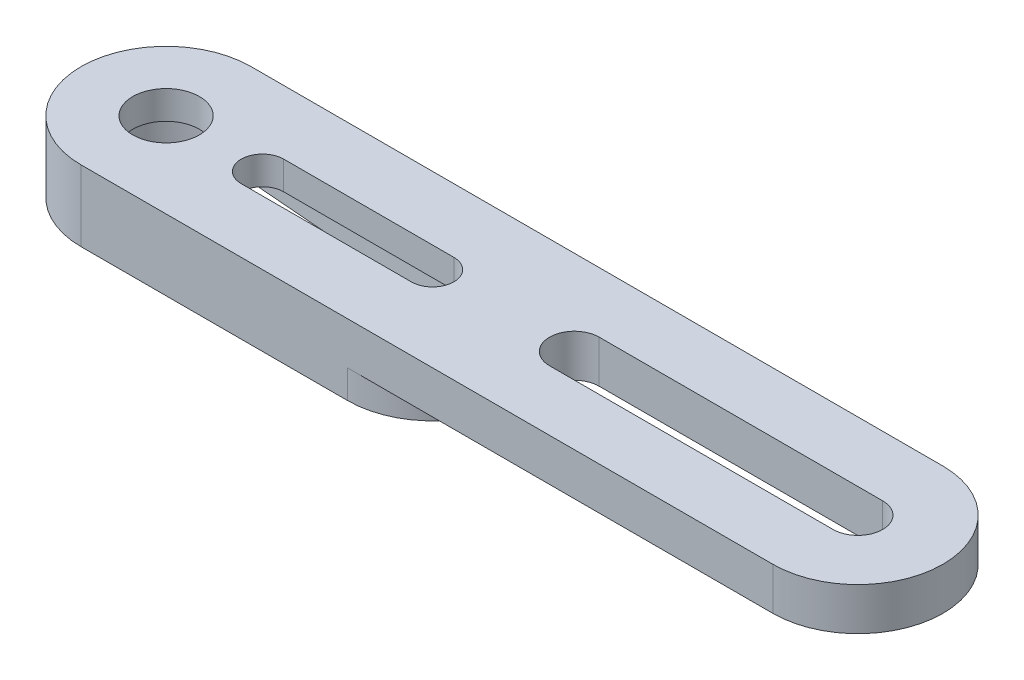
ISO-10303-21;
HEADER;
FILE_DESCRIPTION(('STEP AP214'),'2;1');
FILE_NAME('part.step','',(''),(''),'','','');
FILE_SCHEMA(('AUTOMOTIVE_DESIGN { 1 0 10303 214 1 1 1 1 }'));
ENDSEC;
DATA;
#1=APPLICATION_CONTEXT('core data for automotive mechanical design processes');
#2=APPLICATION_PROTOCOL_DEFINITION('international standard','automotive_design',2000,#1);
#3=PRODUCT_CONTEXT('',#1,'mechanical');
#4=PRODUCT('Part','Part','',(#3));
#5=PRODUCT_RELATED_PRODUCT_CATEGORY('part','',(#4));
#6=PRODUCT_DEFINITION_FORMATION('','',#4);
#7=PRODUCT_DEFINITION_CONTEXT('part definition',#1,'design');
#8=PRODUCT_DEFINITION('design','',#6,#7);
#9=PRODUCT_DEFINITION_SHAPE('','',#8);
#10=(LENGTH_UNIT() NAMED_UNIT(*) SI_UNIT(.MILLI.,.METRE.));
#11=(NAMED_UNIT(*) PLANE_ANGLE_UNIT() SI_UNIT($,.RADIAN.));
#12=(NAMED_UNIT(*) SI_UNIT($,.STERADIAN.) SOLID_ANGLE_UNIT());
#13=UNCERTAINTY_MEASURE_WITH_UNIT(LENGTH_MEASURE(1.E-05),#10,'distance_accuracy_value','');
#14=(GEOMETRIC_REPRESENTATION_CONTEXT(3) GLOBAL_UNCERTAINTY_ASSIGNED_CONTEXT((#13)) GLOBAL_UNIT_ASSIGNED_CONTEXT((#10,
#11,#12)) REPRESENTATION_CONTEXT('',''));
#15=CARTESIAN_POINT('',(0.,0.,0.));
#16=DIRECTION('',(0.,0.,1.));
#17=DIRECTION('',(1.,0.,0.));
#18=AXIS2_PLACEMENT_3D('',#15,#16,#17);
#19=CARTESIAN_POINT('',(0.,2.,0.));
#20=DIRECTION('',(0.,1.,0.));
#21=DIRECTION('',(0.,0.,1.));
#22=AXIS2_PLACEMENT_3D('',#19,#20,#21);
#23=PLANE('',#22);
#24=DIRECTION('',(1.,0.,0.));
#25=VECTOR('',#24,1.);
#26=CARTESIAN_POINT('',(0.,2.,6.));
#27=LINE('',#26,#25);
#28=CARTESIAN_POINT('',(0.,2.,6.));
#29=VERTEX_POINT('',#28);
#30=CARTESIAN_POINT('',(48.8,2.,6.));
#31=VERTEX_POINT('',#30);
#32=EDGE_CURVE('E245',#29,#31,#27,.T.);
#33=ORIENTED_EDGE('',*,*,#32,.T.);
#34=CARTESIAN_POINT('',(48.8,2.,0.));
#35=DIRECTION('',(0.,1.,0.));
#36=DIRECTION('',(0.,0.,1.));
#37=AXIS2_PLACEMENT_3D('',#34,#35,#36);
#38=CIRCLE('',#37,6.);
#39=CARTESIAN_POINT('',(48.8,2.,-6.));
#40=VERTEX_POINT('',#39);
#41=EDGE_CURVE('E199',#31,#40,#38,.T.);
#42=ORIENTED_EDGE('',*,*,#41,.T.);
#43=DIRECTION('',(-1.,0.,0.));
#44=VECTOR('',#43,1.);
#45=CARTESIAN_POINT('',(0.,2.,-6.));
#46=LINE('',#45,#44);
#47=CARTESIAN_POINT('',(0.,2.,-6.));
#48=VERTEX_POINT('',#47);
#49=EDGE_CURVE('E247',#40,#48,#46,.T.);
#50=ORIENTED_EDGE('',*,*,#49,.T.);
#51=CARTESIAN_POINT('',(0.,2.,0.));
#52=DIRECTION('',(0.,1.,0.));
#53=DIRECTION('',(0.,0.,1.));
#54=AXIS2_PLACEMENT_3D('',#51,#52,#53);
#55=CIRCLE('',#54,6.);
#56=EDGE_CURVE('E250',#48,#29,#55,.T.);
#57=ORIENTED_EDGE('',*,*,#56,.T.);
#58=EDGE_LOOP('',(#33,#42,#50,#57));
#59=FACE_BOUND('',#58,.T.);
#60=CARTESIAN_POINT('',(0.,2.,0.));
#61=DIRECTION('',(0.,1.,0.));
#62=DIRECTION('',(0.,0.,1.));
#63=AXIS2_PLACEMENT_3D('',#60,#61,#62);
#64=CIRCLE('',#63,2.35);
#65=CARTESIAN_POINT('',(0.,2.,2.35));
#66=VERTEX_POINT('',#65);
#67=EDGE_CURVE('E253',#66,#66,#64,.T.);
#68=ORIENTED_EDGE('',*,*,#67,.F.);
#69=EDGE_LOOP('',(#68));
#70=FACE_BOUND('',#69,.T.);
#71=DIRECTION('',(-1.,0.,0.));
#72=VECTOR('',#71,1.);
#73=CARTESIAN_POINT('',(0.,2.,-1.74999999999999));
#74=LINE('',#73,#72);
#75=CARTESIAN_POINT('',(48.8,2.,-1.75));
#76=VERTEX_POINT('',#75);
#77=CARTESIAN_POINT('',(28.8,2.,-1.75));
#78=VERTEX_POINT('',#77);
#79=EDGE_CURVE('E192',#76,#78,#74,.T.);
#80=ORIENTED_EDGE('',*,*,#79,.F.);
#81=CARTESIAN_POINT('',(48.8,2.,0.));
#82=DIRECTION('',(0.,1.,0.));
#83=DIRECTION('',(0.,0.,1.));
#84=AXIS2_PLACEMENT_3D('',#81,#82,#83);
#85=CIRCLE('',#84,1.75);
#86=CARTESIAN_POINT('',(48.8,2.,1.75));
#87=VERTEX_POINT('',#86);
#88=EDGE_CURVE('E219',#87,#76,#85,.T.);
#89=ORIENTED_EDGE('',*,*,#88,.F.);
#90=DIRECTION('',(-1.,0.,0.));
#91=VECTOR('',#90,1.);
#92=CARTESIAN_POINT('',(0.,2.,1.75000000000001));
#93=LINE('',#92,#91);
#94=CARTESIAN_POINT('',(28.8,2.,1.75));
#95=VERTEX_POINT('',#94);
#96=EDGE_CURVE('E221',#87,#95,#93,.T.);
#97=ORIENTED_EDGE('',*,*,#96,.T.);
#98=CARTESIAN_POINT('',(28.8,2.,0.));
#99=DIRECTION('',(0.,1.,0.));
#100=DIRECTION('',(0.,0.,1.));
#101=AXIS2_PLACEMENT_3D('',#98,#99,#100);
#102=CIRCLE('',#101,1.75);
#103=EDGE_CURVE('E224',#78,#95,#102,.T.);
#104=ORIENTED_EDGE('',*,*,#103,.F.);
#105=EDGE_LOOP('',(#80,#89,#97,#104));
#106=FACE_BOUND('',#105,.T.);
#107=CARTESIAN_POINT('',(18.8,2.,0.));
#108=DIRECTION('',(0.,1.,0.));
#109=DIRECTION('',(0.,0.,1.));
#110=AXIS2_PLACEMENT_3D('',#107,#108,#109);
#111=CIRCLE('',#110,1.5);
#112=CARTESIAN_POINT('',(18.8,2.,1.5));
#113=VERTEX_POINT('',#112);
#114=CARTESIAN_POINT('',(18.8,2.,-1.5));
#115=VERTEX_POINT('',#114);
#116=EDGE_CURVE('E180',#113,#115,#111,.T.);
#117=ORIENTED_EDGE('',*,*,#116,.F.);
#118=DIRECTION('',(-1.,0.,0.));
#119=VECTOR('',#118,1.);
#120=CARTESIAN_POINT('',(0.,2.,1.5));
#121=LINE('',#120,#119);
#122=CARTESIAN_POINT('',(6.8,2.,1.5));
#123=VERTEX_POINT('',#122);
#124=EDGE_CURVE('E59',#113,#123,#121,.T.);
#125=ORIENTED_EDGE('',*,*,#124,.T.);
#126=CARTESIAN_POINT('',(6.8,2.,0.));
#127=DIRECTION('',(0.,1.,0.));
#128=DIRECTION('',(0.,0.,1.));
#129=AXIS2_PLACEMENT_3D('',#126,#127,#128);
#130=CIRCLE('',#129,1.5);
#131=CARTESIAN_POINT('',(6.8,2.,-1.5));
#132=VERTEX_POINT('',#131);
#133=EDGE_CURVE('E185',#132,#123,#130,.T.);
#134=ORIENTED_EDGE('',*,*,#133,.F.);
#135=DIRECTION('',(-1.,0.,0.));
#136=VECTOR('',#135,1.);
#137=CARTESIAN_POINT('',(0.,2.,-1.5));
#138=LINE('',#137,#136);
#139=EDGE_CURVE('E171',#115,#132,#138,.T.);
#140=ORIENTED_EDGE('',*,*,#139,.F.);
#141=EDGE_LOOP('',(#117,#125,#134,#140));
#142=FACE_BOUND('',#141,.T.);
#143=ADVANCED_FACE('F44',(#59,#70,#106,#142),#23,.T.);
#144=CARTESIAN_POINT('',(0.,0.,0.));
#145=DIRECTION('',(0.,1.,0.));
#146=DIRECTION('',(0.,0.,1.));
#147=AXIS2_PLACEMENT_3D('',#144,#145,#146);
#148=PLANE('',#147);
#149=CARTESIAN_POINT('',(0.,0.,0.));
#150=DIRECTION('',(0.,1.,0.));
#151=DIRECTION('',(0.,0.,1.));
#152=AXIS2_PLACEMENT_3D('',#149,#150,#151);
#153=CIRCLE('',#152,2.35);
#154=CARTESIAN_POINT('',(0.,0.,2.35));
#155=VERTEX_POINT('',#154);
#156=EDGE_CURVE('E232',#155,#155,#153,.T.);
#157=ORIENTED_EDGE('',*,*,#156,.T.);
#158=EDGE_LOOP('',(#157));
#159=FACE_BOUND('',#158,.T.);
#160=CARTESIAN_POINT('',(18.8,0.,0.));
#161=DIRECTION('',(0.,1.,0.));
#162=DIRECTION('',(0.,0.,1.));
#163=AXIS2_PLACEMENT_3D('',#160,#161,#162);
#164=CIRCLE('',#163,2.6);
#165=CARTESIAN_POINT('',(19.0074468085106,0.,2.59171098343136));
#166=VERTEX_POINT('',#165);
#167=CARTESIAN_POINT('',(19.0074468085106,0.,-2.59171098343136));
#168=VERTEX_POINT('',#167);
#169=EDGE_CURVE('E256',#166,#168,#164,.T.);
#170=ORIENTED_EDGE('',*,*,#169,.F.);
#171=DIRECTION('',(-0.99681191670437,0.,0.0797872340425532));
#172=VECTOR('',#171,1.);
#173=CARTESIAN_POINT('',(0.327127659574468,0.,4.08692885848792));
#174=LINE('',#173,#172);
#175=CARTESIAN_POINT('',(0.327127659574468,0.,4.08692885848792));
#176=VERTEX_POINT('',#175);
#177=EDGE_CURVE('E284',#166,#176,#174,.T.);
#178=ORIENTED_EDGE('',*,*,#177,.T.);
#179=CARTESIAN_POINT('',(0.,0.,0.));
#180=DIRECTION('',(0.,1.,0.));
#181=DIRECTION('',(0.,0.,1.));
#182=AXIS2_PLACEMENT_3D('',#179,#180,#181);
#183=CIRCLE('',#182,4.1);
#184=CARTESIAN_POINT('',(0.327127659574468,0.,-4.08692885848792));
#185=VERTEX_POINT('',#184);
#186=EDGE_CURVE('E287',#185,#176,#183,.T.);
#187=ORIENTED_EDGE('',*,*,#186,.F.);
#188=DIRECTION('',(0.99681191670437,0.,0.0797872340425532));
#189=VECTOR('',#188,1.);
#190=CARTESIAN_POINT('',(0.327127659574468,0.,-4.08692885848792));
#191=LINE('',#190,#189);
#192=EDGE_CURVE('E263',#185,#168,#191,.T.);
#193=ORIENTED_EDGE('',*,*,#192,.T.);
#194=EDGE_LOOP('',(#170,#178,#187,#193));
#195=FACE_BOUND('',#194,.T.);
#196=DIRECTION('',(-1.,0.,0.));
#197=VECTOR('',#196,1.);
#198=CARTESIAN_POINT('',(0.,0.,1.5));
#199=LINE('',#198,#197);
#200=CARTESIAN_POINT('',(18.8,0.,1.5));
#201=VERTEX_POINT('',#200);
#202=CARTESIAN_POINT('',(6.8,0.,1.5));
#203=VERTEX_POINT('',#202);
#204=EDGE_CURVE('E12',#201,#203,#199,.T.);
#205=ORIENTED_EDGE('',*,*,#204,.F.);
#206=CARTESIAN_POINT('',(18.8,0.,0.));
#207=DIRECTION('',(0.,1.,0.));
#208=DIRECTION('',(0.,0.,1.));
#209=AXIS2_PLACEMENT_3D('',#206,#207,#208);
#210=CIRCLE('',#209,1.5);
#211=CARTESIAN_POINT('',(18.8,0.,-1.5));
#212=VERTEX_POINT('',#211);
#213=EDGE_CURVE('E295',#201,#212,#210,.T.);
#214=ORIENTED_EDGE('',*,*,#213,.T.);
#215=DIRECTION('',(-1.,0.,0.));
#216=VECTOR('',#215,1.);
#217=CARTESIAN_POINT('',(0.,0.,-1.5));
#218=LINE('',#217,#216);
#219=CARTESIAN_POINT('',(6.8,0.,-1.5));
#220=VERTEX_POINT('',#219);
#221=EDGE_CURVE('E174',#212,#220,#218,.T.);
#222=ORIENTED_EDGE('',*,*,#221,.T.);
#223=CARTESIAN_POINT('',(6.8,0.,0.));
#224=DIRECTION('',(0.,1.,0.));
#225=DIRECTION('',(0.,0.,1.));
#226=AXIS2_PLACEMENT_3D('',#223,#224,#225);
#227=CIRCLE('',#226,1.5);
#228=EDGE_CURVE('E52',#220,#203,#227,.T.);
#229=ORIENTED_EDGE('',*,*,#228,.T.);
#230=EDGE_LOOP('',(#205,#214,#222,#229));
#231=FACE_BOUND('',#230,.T.);
#232=ADVANCED_FACE('F315',(#159,#195,#231),#148,.F.);
#233=CARTESIAN_POINT('',(18.8,-3.,0.));
#234=DIRECTION('',(0.,1.,0.));
#235=DIRECTION('',(0.,0.,1.));
#236=AXIS2_PLACEMENT_3D('',#233,#234,#235);
#237=CYLINDRICAL_SURFACE('',#236,6.);
#238=DIRECTION('',(0.,1.,0.));
#239=VECTOR('',#238,1.);
#240=CARTESIAN_POINT('',(18.8,-3.,-6.));
#241=LINE('',#240,#239);
#242=CARTESIAN_POINT('',(18.8,-3.,-6.));
#243=VERTEX_POINT('',#242);
#244=CARTESIAN_POINT('',(18.8,-1.,-6.));
#245=VERTEX_POINT('',#244);
#246=EDGE_CURVE('E306',#243,#245,#241,.T.);
#247=ORIENTED_EDGE('',*,*,#246,.T.);
#248=CARTESIAN_POINT('',(18.8,-1.,0.));
#249=DIRECTION('',(0.,1.,0.));
#250=DIRECTION('',(0.,0.,1.));
#251=AXIS2_PLACEMENT_3D('',#248,#249,#250);
#252=CIRCLE('',#251,6.);
#253=CARTESIAN_POINT('',(18.8,-1.,6.));
#254=VERTEX_POINT('',#253);
#255=EDGE_CURVE('E212',#254,#245,#252,.T.);
#256=ORIENTED_EDGE('',*,*,#255,.F.);
#257=DIRECTION('',(0.,1.,0.));
#258=VECTOR('',#257,1.);
#259=CARTESIAN_POINT('',(18.8,-3.,6.));
#260=LINE('',#259,#258);
#261=CARTESIAN_POINT('',(18.8,-3.,6.));
#262=VERTEX_POINT('',#261);
#263=EDGE_CURVE('E282',#262,#254,#260,.T.);
#264=ORIENTED_EDGE('',*,*,#263,.F.);
#265=CARTESIAN_POINT('',(18.8,-3.,0.));
#266=DIRECTION('',(0.,1.,0.));
#267=DIRECTION('',(0.,0.,1.));
#268=AXIS2_PLACEMENT_3D('',#265,#266,#267);
#269=CIRCLE('',#268,6.);
#270=EDGE_CURVE('E262',#262,#243,#269,.T.);
#271=ORIENTED_EDGE('',*,*,#270,.T.);
#272=EDGE_LOOP('',(#247,#256,#264,#271));
#273=FACE_BOUND('',#272,.T.);
#274=ADVANCED_FACE('F338',(#273),#237,.T.);
#275=CARTESIAN_POINT('',(18.8,-3.,0.));
#276=DIRECTION('',(0.,1.,0.));
#277=DIRECTION('',(0.,0.,1.));
#278=AXIS2_PLACEMENT_3D('',#275,#276,#277);
#279=CYLINDRICAL_SURFACE('',#278,2.6);
#280=ORIENTED_EDGE('',*,*,#169,.T.);
#281=DIRECTION('',(0.,1.,0.));
#282=VECTOR('',#281,1.);
#283=CARTESIAN_POINT('',(19.0074468085106,-3.,-2.59171098343136));
#284=LINE('',#283,#282);
#285=CARTESIAN_POINT('',(19.0074468085106,-3.,-2.59171098343136));
#286=VERTEX_POINT('',#285);
#287=EDGE_CURVE('E292',#286,#168,#284,.T.);
#288=ORIENTED_EDGE('',*,*,#287,.F.);
#289=CARTESIAN_POINT('',(18.8,-3.,0.));
#290=DIRECTION('',(0.,1.,0.));
#291=DIRECTION('',(0.,0.,1.));
#292=AXIS2_PLACEMENT_3D('',#289,#290,#291);
#293=CIRCLE('',#292,2.6);
#294=CARTESIAN_POINT('',(19.0074468085106,-3.,2.59171098343136));
#295=VERTEX_POINT('',#294);
#296=EDGE_CURVE('E272',#295,#286,#293,.T.);
#297=ORIENTED_EDGE('',*,*,#296,.F.);
#298=DIRECTION('',(0.,1.,0.));
#299=VECTOR('',#298,1.);
#300=CARTESIAN_POINT('',(19.0074468085106,-3.,2.59171098343136));
#301=LINE('',#300,#299);
#302=EDGE_CURVE('E300',#295,#166,#301,.T.);
#303=ORIENTED_EDGE('',*,*,#302,.T.);
#304=EDGE_LOOP('',(#280,#288,#297,#303));
#305=FACE_BOUND('',#304,.T.);
#306=ADVANCED_FACE('F360',(#305),#279,.F.);
#307=CARTESIAN_POINT('',(0.327127659574468,-3.,-4.08692885848792));
#308=DIRECTION('',(-0.0797872340425532,0.,0.996811916704369));
#309=DIRECTION('',(0.99681191670437,0.,0.0797872340425532));
#310=AXIS2_PLACEMENT_3D('',#307,#308,#309);
#311=PLANE('',#310);
#312=ORIENTED_EDGE('',*,*,#192,.F.);
#313=DIRECTION('',(0.,1.,0.));
#314=VECTOR('',#313,1.);
#315=CARTESIAN_POINT('',(0.327127659574468,-3.,-4.08692885848792));
#316=LINE('',#315,#314);
#317=CARTESIAN_POINT('',(0.327127659574468,-3.,-4.08692885848792));
#318=VERTEX_POINT('',#317);
#319=EDGE_CURVE('E296',#318,#185,#316,.T.);
#320=ORIENTED_EDGE('',*,*,#319,.F.);
#321=DIRECTION('',(0.99681191670437,0.,0.0797872340425532));
#322=VECTOR('',#321,1.);
#323=CARTESIAN_POINT('',(0.327127659574468,-3.,-4.08692885848792));
#324=LINE('',#323,#322);
#325=EDGE_CURVE('E279',#318,#286,#324,.T.);
#326=ORIENTED_EDGE('',*,*,#325,.T.);
#327=ORIENTED_EDGE('',*,*,#287,.T.);
#328=EDGE_LOOP('',(#312,#320,#326,#327));
#329=FACE_BOUND('',#328,.T.);
#330=ADVANCED_FACE('F356',(#329),#311,.T.);
#331=CARTESIAN_POINT('',(0.,-3.,0.));
#332=DIRECTION('',(0.,1.,0.));
#333=DIRECTION('',(0.,0.,1.));
#334=AXIS2_PLACEMENT_3D('',#331,#332,#333);
#335=CYLINDRICAL_SURFACE('',#334,4.1);
#336=ORIENTED_EDGE('',*,*,#186,.T.);
#337=DIRECTION('',(0.,1.,0.));
#338=VECTOR('',#337,1.);
#339=CARTESIAN_POINT('',(0.327127659574468,-3.,4.08692885848792));
#340=LINE('',#339,#338);
#341=CARTESIAN_POINT('',(0.327127659574468,-3.,4.08692885848792));
#342=VERTEX_POINT('',#341);
#343=EDGE_CURVE('E298',#342,#176,#340,.T.);
#344=ORIENTED_EDGE('',*,*,#343,.F.);
#345=CARTESIAN_POINT('',(0.,-3.,0.));
#346=DIRECTION('',(0.,1.,0.));
#347=DIRECTION('',(0.,0.,1.));
#348=AXIS2_PLACEMENT_3D('',#345,#346,#347);
#349=CIRCLE('',#348,4.1);
#350=EDGE_CURVE('E277',#318,#342,#349,.T.);
#351=ORIENTED_EDGE('',*,*,#350,.F.);
#352=ORIENTED_EDGE('',*,*,#319,.T.);
#353=EDGE_LOOP('',(#336,#344,#351,#352));
#354=FACE_BOUND('',#353,.T.);
#355=ADVANCED_FACE('F359',(#354),#335,.F.);
#356=CARTESIAN_POINT('',(0.,-3.,6.));
#357=DIRECTION('',(0.,0.,1.));
#358=DIRECTION('',(1.,0.,0.));
#359=AXIS2_PLACEMENT_3D('',#356,#357,#358);
#360=PLANE('',#359);
#361=ORIENTED_EDGE('',*,*,#263,.T.);
#362=DIRECTION('',(-1.,0.,0.));
#363=VECTOR('',#362,1.);
#364=CARTESIAN_POINT('',(0.,-1.,6.));
#365=LINE('',#364,#363);
#366=CARTESIAN_POINT('',(48.8,-1.,6.));
#367=VERTEX_POINT('',#366);
#368=EDGE_CURVE('E214',#367,#254,#365,.T.);
#369=ORIENTED_EDGE('',*,*,#368,.F.);
#370=DIRECTION('',(0.,1.,0.));
#371=VECTOR('',#370,1.);
#372=CARTESIAN_POINT('',(48.8,-1.,6.));
#373=LINE('',#372,#371);
#374=EDGE_CURVE('E229',#367,#31,#373,.T.);
#375=ORIENTED_EDGE('',*,*,#374,.T.);
#376=ORIENTED_EDGE('',*,*,#32,.F.);
#377=DIRECTION('',(0.,1.,0.));
#378=VECTOR('',#377,1.);
#379=CARTESIAN_POINT('',(0.,-3.,6.));
#380=LINE('',#379,#378);
#381=CARTESIAN_POINT('',(0.,-3.,6.));
#382=VERTEX_POINT('',#381);
#383=EDGE_CURVE('E302',#382,#29,#380,.T.);
#384=ORIENTED_EDGE('',*,*,#383,.F.);
#385=DIRECTION('',(1.,0.,0.));
#386=VECTOR('',#385,1.);
#387=CARTESIAN_POINT('',(0.,-3.,6.));
#388=LINE('',#387,#386);
#389=EDGE_CURVE('E259',#382,#262,#388,.T.);
#390=ORIENTED_EDGE('',*,*,#389,.T.);
#391=EDGE_LOOP('',(#361,#369,#375,#376,#384,#390));
#392=FACE_BOUND('',#391,.T.);
#393=ADVANCED_FACE('F46',(#392),#360,.T.);
#394=CARTESIAN_POINT('',(0.,-3.,0.));
#395=DIRECTION('',(0.,1.,0.));
#396=DIRECTION('',(0.,0.,1.));
#397=AXIS2_PLACEMENT_3D('',#394,#395,#396);
#398=CYLINDRICAL_SURFACE('',#397,6.);
#399=ORIENTED_EDGE('',*,*,#383,.T.);
#400=ORIENTED_EDGE('',*,*,#56,.F.);
#401=DIRECTION('',(0.,1.,0.));
#402=VECTOR('',#401,1.);
#403=CARTESIAN_POINT('',(0.,-3.,-6.));
#404=LINE('',#403,#402);
#405=CARTESIAN_POINT('',(0.,-3.,-6.));
#406=VERTEX_POINT('',#405);
#407=EDGE_CURVE('E304',#406,#48,#404,.T.);
#408=ORIENTED_EDGE('',*,*,#407,.F.);
#409=CARTESIAN_POINT('',(0.,-3.,0.));
#410=DIRECTION('',(0.,1.,0.));
#411=DIRECTION('',(0.,0.,1.));
#412=AXIS2_PLACEMENT_3D('',#409,#410,#411);
#413=CIRCLE('',#412,6.);
#414=EDGE_CURVE('E269',#406,#382,#413,.T.);
#415=ORIENTED_EDGE('',*,*,#414,.T.);
#416=EDGE_LOOP('',(#399,#400,#408,#415));
#417=FACE_BOUND('',#416,.T.);
#418=ADVANCED_FACE('F372',(#417),#398,.T.);
#419=CARTESIAN_POINT('',(0.,-3.,-6.));
#420=DIRECTION('',(0.,0.,-1.));
#421=DIRECTION('',(-1.,0.,0.));
#422=AXIS2_PLACEMENT_3D('',#419,#420,#421);
#423=PLANE('',#422);
#424=ORIENTED_EDGE('',*,*,#407,.T.);
#425=ORIENTED_EDGE('',*,*,#49,.F.);
#426=DIRECTION('',(0.,1.,0.));
#427=VECTOR('',#426,1.);
#428=CARTESIAN_POINT('',(48.8,-1.,-6.));
#429=LINE('',#428,#427);
#430=CARTESIAN_POINT('',(48.8,-1.,-6.));
#431=VERTEX_POINT('',#430);
#432=EDGE_CURVE('E233',#431,#40,#429,.T.);
#433=ORIENTED_EDGE('',*,*,#432,.F.);
#434=DIRECTION('',(-1.,0.,0.));
#435=VECTOR('',#434,1.);
#436=CARTESIAN_POINT('',(0.,-1.,-6.));
#437=LINE('',#436,#435);
#438=EDGE_CURVE('E209',#431,#245,#437,.T.);
#439=ORIENTED_EDGE('',*,*,#438,.T.);
#440=ORIENTED_EDGE('',*,*,#246,.F.);
#441=DIRECTION('',(-1.,0.,0.));
#442=VECTOR('',#441,1.);
#443=CARTESIAN_POINT('',(0.,-3.,-6.));
#444=LINE('',#443,#442);
#445=EDGE_CURVE('E266',#243,#406,#444,.T.);
#446=ORIENTED_EDGE('',*,*,#445,.T.);
#447=EDGE_LOOP('',(#424,#425,#433,#439,#440,#446));
#448=FACE_BOUND('',#447,.T.);
#449=ADVANCED_FACE('F367',(#448),#423,.T.);
#450=CARTESIAN_POINT('',(0.327127659574468,-3.,4.08692885848792));
#451=DIRECTION('',(-0.0797872340425532,0.,-0.996811916704369));
#452=DIRECTION('',(-0.99681191670437,0.,0.0797872340425532));
#453=AXIS2_PLACEMENT_3D('',#450,#451,#452);
#454=PLANE('',#453);
#455=ORIENTED_EDGE('',*,*,#177,.F.);
#456=ORIENTED_EDGE('',*,*,#302,.F.);
#457=DIRECTION('',(-0.99681191670437,0.,0.0797872340425532));
#458=VECTOR('',#457,1.);
#459=CARTESIAN_POINT('',(0.327127659574468,-3.,4.08692885848792));
#460=LINE('',#459,#458);
#461=EDGE_CURVE('E274',#295,#342,#460,.T.);
#462=ORIENTED_EDGE('',*,*,#461,.T.);
#463=ORIENTED_EDGE('',*,*,#343,.T.);
#464=EDGE_LOOP('',(#455,#456,#462,#463));
#465=FACE_BOUND('',#464,.T.);
#466=ADVANCED_FACE('F354',(#465),#454,.T.);
#467=CARTESIAN_POINT('',(0.,-3.,0.));
#468=DIRECTION('',(0.,1.,0.));
#469=DIRECTION('',(0.,0.,1.));
#470=AXIS2_PLACEMENT_3D('',#467,#468,#469);
#471=PLANE('',#470);
#472=ORIENTED_EDGE('',*,*,#389,.F.);
#473=ORIENTED_EDGE('',*,*,#414,.F.);
#474=ORIENTED_EDGE('',*,*,#445,.F.);
#475=ORIENTED_EDGE('',*,*,#270,.F.);
#476=EDGE_LOOP('',(#472,#473,#474,#475));
#477=FACE_BOUND('',#476,.T.);
#478=ORIENTED_EDGE('',*,*,#296,.T.);
#479=ORIENTED_EDGE('',*,*,#325,.F.);
#480=ORIENTED_EDGE('',*,*,#350,.T.);
#481=ORIENTED_EDGE('',*,*,#461,.F.);
#482=EDGE_LOOP('',(#478,#479,#480,#481));
#483=FACE_BOUND('',#482,.T.);
#484=ADVANCED_FACE('F350',(#477,#483),#471,.F.);
#485=CARTESIAN_POINT('',(0.,2.,0.));
#486=DIRECTION('',(0.,-1.,0.));
#487=DIRECTION('',(0.,0.,-1.));
#488=AXIS2_PLACEMENT_3D('',#485,#486,#487);
#489=CYLINDRICAL_SURFACE('',#488,2.35);
#490=ORIENTED_EDGE('',*,*,#67,.T.);
#491=EDGE_LOOP('',(#490));
#492=FACE_BOUND('',#491,.T.);
#493=ORIENTED_EDGE('',*,*,#156,.F.);
#494=EDGE_LOOP('',(#493));
#495=FACE_BOUND('',#494,.T.);
#496=ADVANCED_FACE('F346',(#492,#495),#489,.F.);
#497=CARTESIAN_POINT('',(48.8,-1.,0.));
#498=DIRECTION('',(0.,1.,0.));
#499=DIRECTION('',(0.,0.,1.));
#500=AXIS2_PLACEMENT_3D('',#497,#498,#499);
#501=CYLINDRICAL_SURFACE('',#500,6.);
#502=ORIENTED_EDGE('',*,*,#41,.F.);
#503=ORIENTED_EDGE('',*,*,#374,.F.);
#504=CARTESIAN_POINT('',(48.8,-1.,0.));
#505=DIRECTION('',(0.,1.,0.));
#506=DIRECTION('',(0.,0.,1.));
#507=AXIS2_PLACEMENT_3D('',#504,#505,#506);
#508=CIRCLE('',#507,6.);
#509=EDGE_CURVE('E206',#367,#431,#508,.T.);
#510=ORIENTED_EDGE('',*,*,#509,.T.);
#511=ORIENTED_EDGE('',*,*,#432,.T.);
#512=EDGE_LOOP('',(#502,#503,#510,#511));
#513=FACE_BOUND('',#512,.T.);
#514=ADVANCED_FACE('F349',(#513),#501,.T.);
#515=CARTESIAN_POINT('',(0.,-1.,-1.74999999999999));
#516=DIRECTION('',(0.,0.,-1.));
#517=DIRECTION('',(-1.,0.,0.));
#518=AXIS2_PLACEMENT_3D('',#515,#516,#517);
#519=PLANE('',#518);
#520=ORIENTED_EDGE('',*,*,#79,.T.);
#521=DIRECTION('',(0.,1.,0.));
#522=VECTOR('',#521,1.);
#523=CARTESIAN_POINT('',(28.8,-1.,-1.75));
#524=LINE('',#523,#522);
#525=CARTESIAN_POINT('',(28.8,-1.,-1.75));
#526=VERTEX_POINT('',#525);
#527=EDGE_CURVE('E236',#526,#78,#524,.T.);
#528=ORIENTED_EDGE('',*,*,#527,.F.);
#529=DIRECTION('',(-1.,0.,0.));
#530=VECTOR('',#529,1.);
#531=CARTESIAN_POINT('',(0.,-1.,-1.74999999999999));
#532=LINE('',#531,#530);
#533=CARTESIAN_POINT('',(48.8,-1.,-1.75));
#534=VERTEX_POINT('',#533);
#535=EDGE_CURVE('E195',#534,#526,#532,.T.);
#536=ORIENTED_EDGE('',*,*,#535,.F.);
#537=DIRECTION('',(0.,1.,0.));
#538=VECTOR('',#537,1.);
#539=CARTESIAN_POINT('',(48.8,-1.,-1.75));
#540=LINE('',#539,#538);
#541=EDGE_CURVE('E216',#534,#76,#540,.T.);
#542=ORIENTED_EDGE('',*,*,#541,.T.);
#543=EDGE_LOOP('',(#520,#528,#536,#542));
#544=FACE_BOUND('',#543,.T.);
#545=ADVANCED_FACE('F343',(#544),#519,.F.);
#546=CARTESIAN_POINT('',(28.8,-1.,0.));
#547=DIRECTION('',(0.,1.,0.));
#548=DIRECTION('',(0.,0.,1.));
#549=AXIS2_PLACEMENT_3D('',#546,#547,#548);
#550=CYLINDRICAL_SURFACE('',#549,1.75);
#551=ORIENTED_EDGE('',*,*,#103,.T.);
#552=DIRECTION('',(0.,1.,0.));
#553=VECTOR('',#552,1.);
#554=CARTESIAN_POINT('',(28.8,-1.,1.75));
#555=LINE('',#554,#553);
#556=CARTESIAN_POINT('',(28.8,-1.,1.75));
#557=VERTEX_POINT('',#556);
#558=EDGE_CURVE('E239',#557,#95,#555,.T.);
#559=ORIENTED_EDGE('',*,*,#558,.F.);
#560=CARTESIAN_POINT('',(28.8,-1.,0.));
#561=DIRECTION('',(0.,1.,0.));
#562=DIRECTION('',(0.,0.,1.));
#563=AXIS2_PLACEMENT_3D('',#560,#561,#562);
#564=CIRCLE('',#563,1.75);
#565=EDGE_CURVE('E204',#526,#557,#564,.T.);
#566=ORIENTED_EDGE('',*,*,#565,.F.);
#567=ORIENTED_EDGE('',*,*,#527,.T.);
#568=EDGE_LOOP('',(#551,#559,#566,#567));
#569=FACE_BOUND('',#568,.T.);
#570=ADVANCED_FACE('F434',(#569),#550,.F.);
#571=CARTESIAN_POINT('',(0.,-1.,1.75000000000001));
#572=DIRECTION('',(0.,0.,-1.));
#573=DIRECTION('',(-1.,0.,0.));
#574=AXIS2_PLACEMENT_3D('',#571,#572,#573);
#575=PLANE('',#574);
#576=ORIENTED_EDGE('',*,*,#96,.F.);
#577=DIRECTION('',(0.,1.,0.));
#578=VECTOR('',#577,1.);
#579=CARTESIAN_POINT('',(48.8,-1.,1.75));
#580=LINE('',#579,#578);
#581=CARTESIAN_POINT('',(48.8,-1.,1.75));
#582=VERTEX_POINT('',#581);
#583=EDGE_CURVE('E241',#582,#87,#580,.T.);
#584=ORIENTED_EDGE('',*,*,#583,.F.);
#585=DIRECTION('',(-1.,0.,0.));
#586=VECTOR('',#585,1.);
#587=CARTESIAN_POINT('',(0.,-1.,1.75000000000001));
#588=LINE('',#587,#586);
#589=EDGE_CURVE('E201',#582,#557,#588,.T.);
#590=ORIENTED_EDGE('',*,*,#589,.T.);
#591=ORIENTED_EDGE('',*,*,#558,.T.);
#592=EDGE_LOOP('',(#576,#584,#590,#591));
#593=FACE_BOUND('',#592,.T.);
#594=ADVANCED_FACE('F441',(#593),#575,.T.);
#595=CARTESIAN_POINT('',(48.8,-1.,0.));
#596=DIRECTION('',(0.,1.,0.));
#597=DIRECTION('',(0.,0.,1.));
#598=AXIS2_PLACEMENT_3D('',#595,#596,#597);
#599=CYLINDRICAL_SURFACE('',#598,1.75);
#600=ORIENTED_EDGE('',*,*,#88,.T.);
#601=ORIENTED_EDGE('',*,*,#541,.F.);
#602=CARTESIAN_POINT('',(48.8,-1.,0.));
#603=DIRECTION('',(0.,1.,0.));
#604=DIRECTION('',(0.,0.,1.));
#605=AXIS2_PLACEMENT_3D('',#602,#603,#604);
#606=CIRCLE('',#605,1.75);
#607=EDGE_CURVE('E198',#582,#534,#606,.T.);
#608=ORIENTED_EDGE('',*,*,#607,.F.);
#609=ORIENTED_EDGE('',*,*,#583,.T.);
#610=EDGE_LOOP('',(#600,#601,#608,#609));
#611=FACE_BOUND('',#610,.T.);
#612=ADVANCED_FACE('F328',(#611),#599,.F.);
#613=CARTESIAN_POINT('',(0.,-1.,0.));
#614=DIRECTION('',(0.,1.,0.));
#615=DIRECTION('',(0.,0.,1.));
#616=AXIS2_PLACEMENT_3D('',#613,#614,#615);
#617=PLANE('',#616);
#618=ORIENTED_EDGE('',*,*,#535,.T.);
#619=ORIENTED_EDGE('',*,*,#565,.T.);
#620=ORIENTED_EDGE('',*,*,#589,.F.);
#621=ORIENTED_EDGE('',*,*,#607,.T.);
#622=EDGE_LOOP('',(#618,#619,#620,#621));
#623=FACE_BOUND('',#622,.T.);
#624=ORIENTED_EDGE('',*,*,#509,.F.);
#625=ORIENTED_EDGE('',*,*,#368,.T.);
#626=ORIENTED_EDGE('',*,*,#255,.T.);
#627=ORIENTED_EDGE('',*,*,#438,.F.);
#628=EDGE_LOOP('',(#624,#625,#626,#627));
#629=FACE_BOUND('',#628,.T.);
#630=ADVANCED_FACE('F321',(#623,#629),#617,.F.);
#631=CARTESIAN_POINT('',(0.,-8.,1.5));
#632=DIRECTION('',(0.,0.,-1.));
#633=DIRECTION('',(-1.,0.,0.));
#634=AXIS2_PLACEMENT_3D('',#631,#632,#633);
#635=PLANE('',#634);
#636=ORIENTED_EDGE('',*,*,#204,.T.);
#637=DIRECTION('',(0.,1.,0.));
#638=VECTOR('',#637,1.);
#639=CARTESIAN_POINT('',(6.8,-8.,1.5));
#640=LINE('',#639,#638);
#641=EDGE_CURVE('E190',#203,#123,#640,.T.);
#642=ORIENTED_EDGE('',*,*,#641,.T.);
#643=ORIENTED_EDGE('',*,*,#124,.F.);
#644=DIRECTION('',(0.,1.,0.));
#645=VECTOR('',#644,1.);
#646=CARTESIAN_POINT('',(18.8,-8.,1.5));
#647=LINE('',#646,#645);
#648=EDGE_CURVE('E177',#201,#113,#647,.T.);
#649=ORIENTED_EDGE('',*,*,#648,.F.);
#650=EDGE_LOOP('',(#636,#642,#643,#649));
#651=FACE_BOUND('',#650,.T.);
#652=ADVANCED_FACE('F319',(#651),#635,.T.);
#653=CARTESIAN_POINT('',(6.8,-8.,0.));
#654=DIRECTION('',(0.,1.,0.));
#655=DIRECTION('',(0.,0.,1.));
#656=AXIS2_PLACEMENT_3D('',#653,#654,#655);
#657=CYLINDRICAL_SURFACE('',#656,1.5);
#658=DIRECTION('',(0.,1.,0.));
#659=VECTOR('',#658,1.);
#660=CARTESIAN_POINT('',(6.8,-8.,-1.5));
#661=LINE('',#660,#659);
#662=EDGE_CURVE('E176',#220,#132,#661,.T.);
#663=ORIENTED_EDGE('',*,*,#662,.T.);
#664=ORIENTED_EDGE('',*,*,#133,.T.);
#665=ORIENTED_EDGE('',*,*,#641,.F.);
#666=ORIENTED_EDGE('',*,*,#228,.F.);
#667=EDGE_LOOP('',(#663,#664,#665,#666));
#668=FACE_BOUND('',#667,.T.);
#669=ADVANCED_FACE('F318',(#668),#657,.F.);
#670=CARTESIAN_POINT('',(0.,-8.,-1.5));
#671=DIRECTION('',(0.,0.,-1.));
#672=DIRECTION('',(-1.,0.,0.));
#673=AXIS2_PLACEMENT_3D('',#670,#671,#672);
#674=PLANE('',#673);
#675=DIRECTION('',(0.,1.,0.));
#676=VECTOR('',#675,1.);
#677=CARTESIAN_POINT('',(18.8,-8.,-1.5));
#678=LINE('',#677,#676);
#679=EDGE_CURVE('E67',#212,#115,#678,.T.);
#680=ORIENTED_EDGE('',*,*,#679,.T.);
#681=ORIENTED_EDGE('',*,*,#139,.T.);
#682=ORIENTED_EDGE('',*,*,#662,.F.);
#683=ORIENTED_EDGE('',*,*,#221,.F.);
#684=EDGE_LOOP('',(#680,#681,#682,#683));
#685=FACE_BOUND('',#684,.T.);
#686=ADVANCED_FACE('F168',(#685),#674,.F.);
#687=CARTESIAN_POINT('',(18.8,-8.,0.));
#688=DIRECTION('',(0.,1.,0.));
#689=DIRECTION('',(0.,0.,1.));
#690=AXIS2_PLACEMENT_3D('',#687,#688,#689);
#691=CYLINDRICAL_SURFACE('',#690,1.5);
#692=ORIENTED_EDGE('',*,*,#648,.T.);
#693=ORIENTED_EDGE('',*,*,#116,.T.);
#694=ORIENTED_EDGE('',*,*,#679,.F.);
#695=ORIENTED_EDGE('',*,*,#213,.F.);
#696=EDGE_LOOP('',(#692,#693,#694,#695));
#697=FACE_BOUND('',#696,.T.);
#698=ADVANCED_FACE('F181',(#697),#691,.F.);
#699=CLOSED_SHELL('',(#143,#232,#274,#306,#330,#355,#393,#418,#449,#466,#484,#496,#514,#545,
#570,#594,#612,#630,#652,#669,#686,#698));
#700=MANIFOLD_SOLID_BREP('B2',#699);
#701=ADVANCED_BREP_SHAPE_REPRESENTATION('',(#18,#700),#14);
#702=SHAPE_DEFINITION_REPRESENTATION(#9,#701);
ENDSEC;
END-ISO-10303-21;
